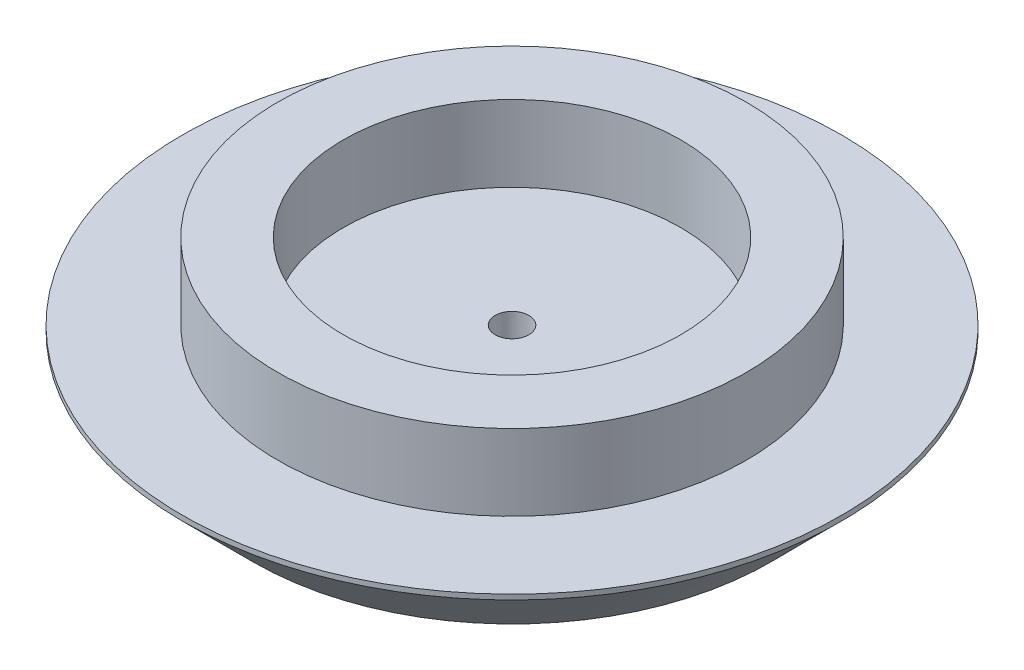
ISO-10303-21;
HEADER;
FILE_DESCRIPTION(('STEP AP214'),'2;1');
FILE_NAME('part.step','',(''),(''),'','','');
FILE_SCHEMA(('AUTOMOTIVE_DESIGN { 1 0 10303 214 1 1 1 1 }'));
ENDSEC;
DATA;
#1=APPLICATION_CONTEXT('core data for automotive mechanical design processes');
#2=APPLICATION_PROTOCOL_DEFINITION('international standard','automotive_design',2000,#1);
#3=PRODUCT_CONTEXT('',#1,'mechanical');
#4=PRODUCT('Part','Part','',(#3));
#5=PRODUCT_RELATED_PRODUCT_CATEGORY('part','',(#4));
#6=PRODUCT_DEFINITION_FORMATION('','',#4);
#7=PRODUCT_DEFINITION_CONTEXT('part definition',#1,'design');
#8=PRODUCT_DEFINITION('design','',#6,#7);
#9=PRODUCT_DEFINITION_SHAPE('','',#8);
#10=(LENGTH_UNIT() NAMED_UNIT(*) SI_UNIT(.MILLI.,.METRE.));
#11=(NAMED_UNIT(*) PLANE_ANGLE_UNIT() SI_UNIT($,.RADIAN.));
#12=(NAMED_UNIT(*) SI_UNIT($,.STERADIAN.) SOLID_ANGLE_UNIT());
#13=UNCERTAINTY_MEASURE_WITH_UNIT(LENGTH_MEASURE(1.E-05),#10,'distance_accuracy_value','');
#14=(GEOMETRIC_REPRESENTATION_CONTEXT(3) GLOBAL_UNCERTAINTY_ASSIGNED_CONTEXT((#13)) GLOBAL_UNIT_ASSIGNED_CONTEXT((#10,
#11,#12)) REPRESENTATION_CONTEXT('',''));
#15=CARTESIAN_POINT('',(0.,0.,0.));
#16=DIRECTION('',(0.,0.,1.));
#17=DIRECTION('',(1.,0.,0.));
#18=AXIS2_PLACEMENT_3D('',#15,#16,#17);
#19=CARTESIAN_POINT('',(-41.275,-9.525,0.));
#20=DIRECTION('',(0.,1.,0.));
#21=DIRECTION('',(0.,0.,1.));
#22=AXIS2_PLACEMENT_3D('',#19,#20,#21);
#23=PLANE('',#22);
#24=CARTESIAN_POINT('',(0.,-9.525,0.));
#25=DIRECTION('',(0.,-1.,0.));
#26=DIRECTION('',(0.,0.,-1.));
#27=AXIS2_PLACEMENT_3D('',#24,#25,#26);
#28=CIRCLE('',#27,2.10819999999999);
#29=CARTESIAN_POINT('',(0.,-9.525,-2.10819999999999));
#30=VERTEX_POINT('',#29);
#31=EDGE_CURVE('E62',#30,#30,#28,.T.);
#32=ORIENTED_EDGE('',*,*,#31,.F.);
#33=EDGE_LOOP('',(#32));
#34=FACE_BOUND('',#33,.T.);
#35=CARTESIAN_POINT('',(0.,-9.525,0.));
#36=DIRECTION('',(0.,1.,0.));
#37=DIRECTION('',(0.,0.,1.));
#38=AXIS2_PLACEMENT_3D('',#35,#36,#37);
#39=CIRCLE('',#38,32.385);
#40=CARTESIAN_POINT('',(0.,-9.525,32.385));
#41=VERTEX_POINT('',#40);
#42=EDGE_CURVE('E37',#41,#41,#39,.F.);
#43=ORIENTED_EDGE('',*,*,#42,.T.);
#44=EDGE_LOOP('',(#43));
#45=FACE_BOUND('',#44,.T.);
#46=ADVANCED_FACE('F30',(#34,#45),#23,.F.);
#47=CARTESIAN_POINT('',(0.,-9.525,0.));
#48=DIRECTION('',(0.,-1.,0.));
#49=DIRECTION('',(0.,0.,-1.));
#50=AXIS2_PLACEMENT_3D('',#47,#48,#49);
#51=CYLINDRICAL_SURFACE('',#50,41.275);
#52=CARTESIAN_POINT('',(0.,-0.634999999999943,0.));
#53=DIRECTION('',(0.,1.,0.));
#54=DIRECTION('',(0.,0.,1.));
#55=AXIS2_PLACEMENT_3D('',#52,#53,#54);
#56=CIRCLE('',#55,41.275);
#57=CARTESIAN_POINT('',(0.,-0.634999999999943,41.275));
#58=VERTEX_POINT('',#57);
#59=EDGE_CURVE('E10',#58,#58,#56,.T.);
#60=ORIENTED_EDGE('',*,*,#59,.T.);
#61=EDGE_LOOP('',(#60));
#62=FACE_BOUND('',#61,.T.);
#63=CARTESIAN_POINT('',(0.,0.,0.));
#64=DIRECTION('',(0.,-1.,0.));
#65=DIRECTION('',(0.,0.,-1.));
#66=AXIS2_PLACEMENT_3D('',#63,#64,#65);
#67=CIRCLE('',#66,41.275);
#68=CARTESIAN_POINT('',(0.,0.,-41.275));
#69=VERTEX_POINT('',#68);
#70=EDGE_CURVE('E41',#69,#69,#67,.T.);
#71=ORIENTED_EDGE('',*,*,#70,.T.);
#72=EDGE_LOOP('',(#71));
#73=FACE_BOUND('',#72,.T.);
#74=ADVANCED_FACE('F69',(#62,#73),#51,.T.);
#75=CARTESIAN_POINT('',(-29.337,0.,0.));
#76=DIRECTION('',(0.,-1.,0.));
#77=DIRECTION('',(0.,0.,-1.));
#78=AXIS2_PLACEMENT_3D('',#75,#76,#77);
#79=PLANE('',#78);
#80=ORIENTED_EDGE('',*,*,#70,.F.);
#81=EDGE_LOOP('',(#80));
#82=FACE_BOUND('',#81,.T.);
#83=CARTESIAN_POINT('',(0.,0.,0.));
#84=DIRECTION('',(0.,-1.,0.));
#85=DIRECTION('',(0.,0.,-1.));
#86=AXIS2_PLACEMENT_3D('',#83,#84,#85);
#87=CIRCLE('',#86,29.337);
#88=CARTESIAN_POINT('',(0.,0.,-29.337));
#89=VERTEX_POINT('',#88);
#90=EDGE_CURVE('E45',#89,#89,#87,.T.);
#91=ORIENTED_EDGE('',*,*,#90,.T.);
#92=EDGE_LOOP('',(#91));
#93=FACE_BOUND('',#92,.T.);
#94=ADVANCED_FACE('F73',(#82,#93),#79,.F.);
#95=CARTESIAN_POINT('',(0.,-9.525,0.));
#96=DIRECTION('',(0.,-1.,0.));
#97=DIRECTION('',(0.,0.,-1.));
#98=AXIS2_PLACEMENT_3D('',#95,#96,#97);
#99=CYLINDRICAL_SURFACE('',#98,29.337);
#100=ORIENTED_EDGE('',*,*,#90,.F.);
#101=EDGE_LOOP('',(#100));
#102=FACE_BOUND('',#101,.T.);
#103=CARTESIAN_POINT('',(0.,9.525,0.));
#104=DIRECTION('',(0.,-1.,0.));
#105=DIRECTION('',(0.,0.,-1.));
#106=AXIS2_PLACEMENT_3D('',#103,#104,#105);
#107=CIRCLE('',#106,29.337);
#108=CARTESIAN_POINT('',(0.,9.525,-29.337));
#109=VERTEX_POINT('',#108);
#110=EDGE_CURVE('E50',#109,#109,#107,.T.);
#111=ORIENTED_EDGE('',*,*,#110,.T.);
#112=EDGE_LOOP('',(#111));
#113=FACE_BOUND('',#112,.T.);
#114=ADVANCED_FACE('F78',(#102,#113),#99,.T.);
#115=CARTESIAN_POINT('',(-29.337,9.525,0.));
#116=DIRECTION('',(0.,-1.,0.));
#117=DIRECTION('',(0.,0.,-1.));
#118=AXIS2_PLACEMENT_3D('',#115,#116,#117);
#119=PLANE('',#118);
#120=ORIENTED_EDGE('',*,*,#110,.F.);
#121=EDGE_LOOP('',(#120));
#122=FACE_BOUND('',#121,.T.);
#123=CARTESIAN_POINT('',(0.,9.525,0.));
#124=DIRECTION('',(0.,-1.,0.));
#125=DIRECTION('',(0.,0.,-1.));
#126=AXIS2_PLACEMENT_3D('',#123,#124,#125);
#127=CIRCLE('',#126,21.1455);
#128=CARTESIAN_POINT('',(0.,9.525,-21.1455));
#129=VERTEX_POINT('',#128);
#130=EDGE_CURVE('E53',#129,#129,#127,.T.);
#131=ORIENTED_EDGE('',*,*,#130,.T.);
#132=EDGE_LOOP('',(#131));
#133=FACE_BOUND('',#132,.T.);
#134=ADVANCED_FACE('F82',(#122,#133),#119,.F.);
#135=CARTESIAN_POINT('',(0.,-9.525,0.));
#136=DIRECTION('',(0.,-1.,0.));
#137=DIRECTION('',(0.,0.,-1.));
#138=AXIS2_PLACEMENT_3D('',#135,#136,#137);
#139=CYLINDRICAL_SURFACE('',#138,21.1455);
#140=ORIENTED_EDGE('',*,*,#130,.F.);
#141=EDGE_LOOP('',(#140));
#142=FACE_BOUND('',#141,.T.);
#143=CARTESIAN_POINT('',(0.,0.,0.));
#144=DIRECTION('',(0.,-1.,0.));
#145=DIRECTION('',(0.,0.,-1.));
#146=AXIS2_PLACEMENT_3D('',#143,#144,#145);
#147=CIRCLE('',#146,21.1455);
#148=CARTESIAN_POINT('',(0.,0.,-21.1455));
#149=VERTEX_POINT('',#148);
#150=EDGE_CURVE('E56',#149,#149,#147,.T.);
#151=ORIENTED_EDGE('',*,*,#150,.T.);
#152=EDGE_LOOP('',(#151));
#153=FACE_BOUND('',#152,.T.);
#154=ADVANCED_FACE('F86',(#142,#153),#139,.F.);
#155=CARTESIAN_POINT('',(-21.1455,0.,0.));
#156=DIRECTION('',(0.,-1.,0.));
#157=DIRECTION('',(0.,0.,-1.));
#158=AXIS2_PLACEMENT_3D('',#155,#156,#157);
#159=PLANE('',#158);
#160=CARTESIAN_POINT('',(0.,0.,0.));
#161=DIRECTION('',(0.,-1.,0.));
#162=DIRECTION('',(0.,0.,-1.));
#163=AXIS2_PLACEMENT_3D('',#160,#161,#162);
#164=CIRCLE('',#163,2.10819999999999);
#165=CARTESIAN_POINT('',(0.,0.,-2.10819999999999));
#166=VERTEX_POINT('',#165);
#167=EDGE_CURVE('E59',#166,#166,#164,.T.);
#168=ORIENTED_EDGE('',*,*,#167,.T.);
#169=EDGE_LOOP('',(#168));
#170=FACE_BOUND('',#169,.T.);
#171=ORIENTED_EDGE('',*,*,#150,.F.);
#172=EDGE_LOOP('',(#171));
#173=FACE_BOUND('',#172,.T.);
#174=ADVANCED_FACE('F90',(#170,#173),#159,.F.);
#175=CARTESIAN_POINT('',(0.,-9.525,0.));
#176=DIRECTION('',(0.,1.,0.));
#177=DIRECTION('',(0.,0.,1.));
#178=AXIS2_PLACEMENT_3D('',#175,#176,#177);
#179=CONICAL_SURFACE('',#178,32.385,0.785398163397447);
#180=ORIENTED_EDGE('',*,*,#59,.F.);
#181=EDGE_LOOP('',(#180));
#182=FACE_BOUND('',#181,.T.);
#183=ORIENTED_EDGE('',*,*,#42,.F.);
#184=EDGE_LOOP('',(#183));
#185=FACE_BOUND('',#184,.T.);
#186=ADVANCED_FACE('F32',(#182,#185),#179,.T.);
#187=CARTESIAN_POINT('',(0.,-9.525,0.));
#188=DIRECTION('',(0.,-1.,0.));
#189=DIRECTION('',(0.,0.,-1.));
#190=AXIS2_PLACEMENT_3D('',#187,#188,#189);
#191=CYLINDRICAL_SURFACE('',#190,2.10819999999999);
#192=ORIENTED_EDGE('',*,*,#167,.F.);
#193=EDGE_LOOP('',(#192));
#194=FACE_BOUND('',#193,.T.);
#195=ORIENTED_EDGE('',*,*,#31,.T.);
#196=EDGE_LOOP('',(#195));
#197=FACE_BOUND('',#196,.T.);
#198=ADVANCED_FACE('F66',(#194,#197),#191,.F.);
#199=CLOSED_SHELL('',(#46,#74,#94,#114,#134,#154,#174,#186,#198));
#200=MANIFOLD_SOLID_BREP('B2',#199);
#201=ADVANCED_BREP_SHAPE_REPRESENTATION('',(#18,#200),#14);
#202=SHAPE_DEFINITION_REPRESENTATION(#9,#201);
ENDSEC;
END-ISO-10303-21;
